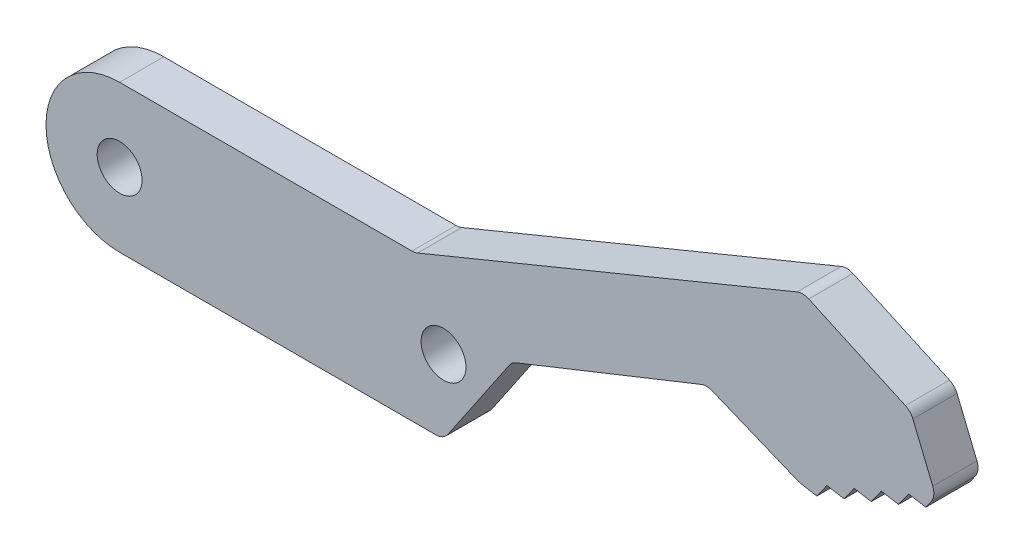
ISO-10303-21;
HEADER;
FILE_DESCRIPTION(('STEP AP214'),'2;1');
FILE_NAME('part.step','',(''),(''),'','','');
FILE_SCHEMA(('AUTOMOTIVE_DESIGN { 1 0 10303 214 1 1 1 1 }'));
ENDSEC;
DATA;
#1=APPLICATION_CONTEXT('core data for automotive mechanical design processes');
#2=APPLICATION_PROTOCOL_DEFINITION('international standard','automotive_design',2000,#1);
#3=PRODUCT_CONTEXT('',#1,'mechanical');
#4=PRODUCT('Part','Part','',(#3));
#5=PRODUCT_RELATED_PRODUCT_CATEGORY('part','',(#4));
#6=PRODUCT_DEFINITION_FORMATION('','',#4);
#7=PRODUCT_DEFINITION_CONTEXT('part definition',#1,'design');
#8=PRODUCT_DEFINITION('design','',#6,#7);
#9=PRODUCT_DEFINITION_SHAPE('','',#8);
#10=(LENGTH_UNIT() NAMED_UNIT(*) SI_UNIT(.MILLI.,.METRE.));
#11=(NAMED_UNIT(*) PLANE_ANGLE_UNIT() SI_UNIT($,.RADIAN.));
#12=(NAMED_UNIT(*) SI_UNIT($,.STERADIAN.) SOLID_ANGLE_UNIT());
#13=UNCERTAINTY_MEASURE_WITH_UNIT(LENGTH_MEASURE(1.E-05),#10,'distance_accuracy_value','');
#14=(GEOMETRIC_REPRESENTATION_CONTEXT(3) GLOBAL_UNCERTAINTY_ASSIGNED_CONTEXT((#13)) GLOBAL_UNIT_ASSIGNED_CONTEXT((#10,
#11,#12)) REPRESENTATION_CONTEXT('',''));
#15=CARTESIAN_POINT('',(0.,0.,0.));
#16=DIRECTION('',(0.,0.,1.));
#17=DIRECTION('',(1.,0.,0.));
#18=AXIS2_PLACEMENT_3D('',#15,#16,#17);
#19=CARTESIAN_POINT('',(17.3962094769043,-11.7918515015879,3.));
#20=DIRECTION('',(0.82775687017251,-0.561086948593719,0.));
#21=DIRECTION('',(0.561086948593719,0.82775687017251,0.));
#22=AXIS2_PLACEMENT_3D('',#19,#20,#21);
#23=PLANE('',#22);
#24=DIRECTION('',(-0.561086948593719,-0.82775687017251,0.));
#25=VECTOR('',#24,1.);
#26=CARTESIAN_POINT('',(17.3962094769043,-11.7918515015879,0.));
#27=LINE('',#26,#25);
#28=CARTESIAN_POINT('',(26.4721926347983,1.59770858592846,0.));
#29=VERTEX_POINT('',#28);
#30=CARTESIAN_POINT('',(22.2975129456313,-4.56108694859372,0.));
#31=VERTEX_POINT('',#30);
#32=EDGE_CURVE('E351',#29,#31,#27,.T.);
#33=ORIENTED_EDGE('',*,*,#32,.F.);
#34=DIRECTION('',(0.,0.,-1.));
#35=VECTOR('',#34,1.);
#36=CARTESIAN_POINT('',(26.4721926347983,1.59770858592845,3.));
#37=LINE('',#36,#35);
#38=CARTESIAN_POINT('',(26.4721926347983,1.59770858592846,3.));
#39=VERTEX_POINT('',#38);
#40=EDGE_CURVE('E254',#29,#39,#37,.F.);
#41=ORIENTED_EDGE('',*,*,#40,.T.);
#42=DIRECTION('',(-0.561086948593719,-0.82775687017251,0.));
#43=VECTOR('',#42,1.);
#44=CARTESIAN_POINT('',(17.3962094769043,-11.7918515015879,3.));
#45=LINE('',#44,#43);
#46=CARTESIAN_POINT('',(22.2975129456313,-4.56108694859372,3.));
#47=VERTEX_POINT('',#46);
#48=EDGE_CURVE('E768',#39,#47,#45,.T.);
#49=ORIENTED_EDGE('',*,*,#48,.T.);
#50=DIRECTION('',(0.,0.,-1.));
#51=VECTOR('',#50,1.);
#52=CARTESIAN_POINT('',(22.2975129456313,-4.56108694859372,0.));
#53=LINE('',#52,#51);
#54=EDGE_CURVE('E251',#47,#31,#53,.T.);
#55=ORIENTED_EDGE('',*,*,#54,.T.);
#56=EDGE_LOOP('',(#33,#41,#49,#55));
#57=FACE_BOUND('',#56,.T.);
#58=ADVANCED_FACE('F34',(#57),#23,.T.);
#59=CARTESIAN_POINT('',(3.01771045687276,-7.56855690668185,3.));
#60=DIRECTION('',(0.370362872235569,-0.928887152925166,0.));
#61=DIRECTION('',(0.928887152925166,0.370362872235569,0.));
#62=AXIS2_PLACEMENT_3D('',#59,#60,#61);
#63=PLANE('',#62);
#64=DIRECTION('',(-0.928887152925166,-0.370362872235569,0.));
#65=VECTOR('',#64,1.);
#66=CARTESIAN_POINT('',(3.01771045687276,-7.56855690668185,3.));
#67=LINE('',#66,#65);
#68=CARTESIAN_POINT('',(39.4964940516571,6.97614534835353,3.));
#69=VERTEX_POINT('',#68);
#70=CARTESIAN_POINT('',(26.9295866327353,1.9655087902599,3.));
#71=VERTEX_POINT('',#70);
#72=EDGE_CURVE('E775',#69,#71,#67,.T.);
#73=ORIENTED_EDGE('',*,*,#72,.T.);
#74=DIRECTION('',(0.,0.,-1.));
#75=VECTOR('',#74,1.);
#76=CARTESIAN_POINT('',(26.9295866327353,1.9655087902599,0.));
#77=LINE('',#76,#75);
#78=CARTESIAN_POINT('',(26.9295866327353,1.9655087902599,0.));
#79=VERTEX_POINT('',#78);
#80=EDGE_CURVE('E243',#71,#79,#77,.T.);
#81=ORIENTED_EDGE('',*,*,#80,.T.);
#82=DIRECTION('',(-0.928887152925166,-0.370362872235569,0.));
#83=VECTOR('',#82,1.);
#84=CARTESIAN_POINT('',(3.01771045687276,-7.56855690668185,0.));
#85=LINE('',#84,#83);
#86=CARTESIAN_POINT('',(39.4964940516571,6.97614534835353,0.));
#87=VERTEX_POINT('',#86);
#88=EDGE_CURVE('E353',#87,#79,#85,.T.);
#89=ORIENTED_EDGE('',*,*,#88,.F.);
#90=DIRECTION('',(0.,0.,-1.));
#91=VECTOR('',#90,1.);
#92=CARTESIAN_POINT('',(39.4964940516571,6.97614534835353,3.));
#93=LINE('',#92,#91);
#94=EDGE_CURVE('E241',#87,#69,#93,.F.);
#95=ORIENTED_EDGE('',*,*,#94,.T.);
#96=EDGE_LOOP('',(#73,#81,#89,#95));
#97=FACE_BOUND('',#96,.T.);
#98=ADVANCED_FACE('F496',(#97),#63,.T.);
#99=CARTESIAN_POINT('',(8.22079154562797,20.0822867610106,3.));
#100=DIRECTION('',(-0.378842481424512,-0.925461168428,0.));
#101=DIRECTION('',(0.925461168428,-0.378842481424512,0.));
#102=AXIS2_PLACEMENT_3D('',#99,#100,#101);
#103=PLANE('',#102);
#104=DIRECTION('',(-0.925461168428,0.378842481424512,0.));
#105=VECTOR('',#104,1.);
#106=CARTESIAN_POINT('',(8.22079154562797,20.0822867610106,3.));
#107=LINE('',#106,#105);
#108=CARTESIAN_POINT('',(46.0879419933528,4.58116609869354,3.));
#109=VERTEX_POINT('',#108);
#110=CARTESIAN_POINT('',(40.2456994053172,6.97271936385637,3.));
#111=VERTEX_POINT('',#110);
#112=EDGE_CURVE('E226',#109,#111,#107,.T.);
#113=ORIENTED_EDGE('',*,*,#112,.T.);
#114=DIRECTION('',(0.,0.,-1.));
#115=VECTOR('',#114,1.);
#116=CARTESIAN_POINT('',(40.2456994053171,6.97271936385637,0.));
#117=LINE('',#116,#115);
#118=CARTESIAN_POINT('',(40.2456994053172,6.97271936385637,0.));
#119=VERTEX_POINT('',#118);
#120=EDGE_CURVE('E278',#111,#119,#117,.T.);
#121=ORIENTED_EDGE('',*,*,#120,.T.);
#122=DIRECTION('',(-0.925461168428,0.378842481424512,0.));
#123=VECTOR('',#122,1.);
#124=CARTESIAN_POINT('',(8.22079154562797,20.0822867610106,0.));
#125=LINE('',#124,#123);
#126=CARTESIAN_POINT('',(46.0879419933528,4.58116609869354,0.));
#127=VERTEX_POINT('',#126);
#128=EDGE_CURVE('E356',#127,#119,#125,.T.);
#129=ORIENTED_EDGE('',*,*,#128,.F.);
#130=DIRECTION('',(0.,0.,-1.));
#131=VECTOR('',#130,1.);
#132=CARTESIAN_POINT('',(46.0879419933528,4.58116609869354,3.));
#133=LINE('',#132,#131);
#134=EDGE_CURVE('E276',#127,#109,#133,.F.);
#135=ORIENTED_EDGE('',*,*,#134,.T.);
#136=EDGE_LOOP('',(#113,#121,#129,#135));
#137=FACE_BOUND('',#136,.T.);
#138=ADVANCED_FACE('F502',(#137),#103,.T.);
#139=CARTESIAN_POINT('',(2.12068725055261,12.2001062019428,3.));
#140=DIRECTION('',(0.171257275030367,0.985226342395073,0.));
#141=DIRECTION('',(-0.985226342395073,0.171257275030367,0.));
#142=AXIS2_PLACEMENT_3D('',#139,#140,#141);
#143=PLANE('',#142);
#144=DIRECTION('',(0.985226342395073,-0.171257275030367,0.));
#145=VECTOR('',#144,1.);
#146=CARTESIAN_POINT('',(2.12068725055261,12.2001062019428,3.));
#147=LINE('',#146,#145);
#148=CARTESIAN_POINT('',(46.2955271997469,4.52140092472648,3.));
#149=VERTEX_POINT('',#148);
#150=CARTESIAN_POINT('',(47.3529322035688,4.33759717145107,3.));
#151=VERTEX_POINT('',#150);
#152=EDGE_CURVE('E212',#149,#151,#147,.T.);
#153=ORIENTED_EDGE('',*,*,#152,.F.);
#154=DIRECTION('',(0.,0.,-1.));
#155=VECTOR('',#154,1.);
#156=CARTESIAN_POINT('',(46.2955271997469,4.52140092472648,0.));
#157=LINE('',#156,#155);
#158=CARTESIAN_POINT('',(46.2955271997469,4.52140092472648,0.));
#159=VERTEX_POINT('',#158);
#160=EDGE_CURVE('E281',#149,#159,#157,.T.);
#161=ORIENTED_EDGE('',*,*,#160,.T.);
#162=DIRECTION('',(0.985226342395073,-0.171257275030367,0.));
#163=VECTOR('',#162,1.);
#164=CARTESIAN_POINT('',(2.12068725055261,12.2001062019428,0.));
#165=LINE('',#164,#163);
#166=CARTESIAN_POINT('',(47.3529322035688,4.33759717145107,0.));
#167=VERTEX_POINT('',#166);
#168=EDGE_CURVE('E239',#159,#167,#165,.T.);
#169=ORIENTED_EDGE('',*,*,#168,.T.);
#170=DIRECTION('',(0.,0.,-1.));
#171=VECTOR('',#170,1.);
#172=CARTESIAN_POINT('',(47.3529322035688,4.33759717145107,3.));
#173=LINE('',#172,#171);
#174=EDGE_CURVE('E232',#151,#167,#173,.T.);
#175=ORIENTED_EDGE('',*,*,#174,.F.);
#176=EDGE_LOOP('',(#153,#161,#169,#175));
#177=FACE_BOUND('',#176,.T.);
#178=ADVANCED_FACE('F237',(#177),#143,.F.);
#179=CARTESIAN_POINT('',(29.3832302084347,-20.911746854221,3.));
#180=DIRECTION('',(-0.814732571298571,0.579836905746106,0.));
#181=DIRECTION('',(-0.579836905746107,-0.814732571298571,0.));
#182=AXIS2_PLACEMENT_3D('',#179,#180,#181);
#183=PLANE('',#182);
#184=DIRECTION('',(0.579836905746107,0.814732571298571,0.));
#185=VECTOR('',#184,1.);
#186=CARTESIAN_POINT('',(29.3832302084347,-20.911746854221,0.));
#187=LINE('',#186,#185);
#188=CARTESIAN_POINT('',(48.0382444817135,5.30053386792921,0.));
#189=VERTEX_POINT('',#188);
#190=EDGE_CURVE('E360',#167,#189,#187,.T.);
#191=ORIENTED_EDGE('',*,*,#190,.T.);
#192=DIRECTION('',(0.,0.,-1.));
#193=VECTOR('',#192,1.);
#194=CARTESIAN_POINT('',(48.0382444817135,5.30053386792921,3.));
#195=LINE('',#194,#193);
#196=CARTESIAN_POINT('',(48.0382444817135,5.30053386792921,3.));
#197=VERTEX_POINT('',#196);
#198=EDGE_CURVE('E234',#197,#189,#195,.T.);
#199=ORIENTED_EDGE('',*,*,#198,.F.);
#200=DIRECTION('',(0.579836905746107,0.814732571298571,0.));
#201=VECTOR('',#200,1.);
#202=CARTESIAN_POINT('',(29.3832302084347,-20.911746854221,3.));
#203=LINE('',#202,#201);
#204=EDGE_CURVE('E217',#151,#197,#203,.T.);
#205=ORIENTED_EDGE('',*,*,#204,.F.);
#206=ORIENTED_EDGE('',*,*,#174,.T.);
#207=EDGE_LOOP('',(#191,#199,#205,#206));
#208=FACE_BOUND('',#207,.T.);
#209=ADVANCED_FACE('F231',(#208),#183,.F.);
#210=CARTESIAN_POINT('',(2.30326040358772,13.2504316830205,3.));
#211=DIRECTION('',(0.171257275030366,0.985226342395073,0.));
#212=DIRECTION('',(-0.985226342395073,0.171257275030366,0.));
#213=AXIS2_PLACEMENT_3D('',#210,#211,#212);
#214=PLANE('',#213);
#215=DIRECTION('',(0.985226342395073,-0.171257275030366,0.));
#216=VECTOR('',#215,1.);
#217=CARTESIAN_POINT('',(2.30326040358772,13.2504316830205,0.));
#218=LINE('',#217,#216);
#219=CARTESIAN_POINT('',(49.2026886599019,5.09812399691749,0.));
#220=VERTEX_POINT('',#219);
#221=EDGE_CURVE('E362',#189,#220,#218,.T.);
#222=ORIENTED_EDGE('',*,*,#221,.T.);
#223=DIRECTION('',(0.,0.,-1.));
#224=VECTOR('',#223,1.);
#225=CARTESIAN_POINT('',(49.2026886599019,5.09812399691749,3.));
#226=LINE('',#225,#224);
#227=CARTESIAN_POINT('',(49.2026886599019,5.09812399691749,3.));
#228=VERTEX_POINT('',#227);
#229=EDGE_CURVE('E245',#228,#220,#226,.T.);
#230=ORIENTED_EDGE('',*,*,#229,.F.);
#231=DIRECTION('',(0.985226342395073,-0.171257275030366,0.));
#232=VECTOR('',#231,1.);
#233=CARTESIAN_POINT('',(2.30326040358772,13.2504316830205,3.));
#234=LINE('',#233,#232);
#235=EDGE_CURVE('E235',#197,#228,#234,.T.);
#236=ORIENTED_EDGE('',*,*,#235,.F.);
#237=ORIENTED_EDGE('',*,*,#198,.T.);
#238=EDGE_LOOP('',(#222,#230,#236,#237));
#239=FACE_BOUND('',#238,.T.);
#240=ADVANCED_FACE('F427',(#239),#214,.F.);
#241=CARTESIAN_POINT('',(30.2517964891723,-21.5298966648462,3.));
#242=DIRECTION('',(-0.81473257129857,0.579836905746108,0.));
#243=DIRECTION('',(-0.579836905746108,-0.81473257129857,0.));
#244=AXIS2_PLACEMENT_3D('',#241,#242,#243);
#245=PLANE('',#244);
#246=DIRECTION('',(0.579836905746108,0.81473257129857,0.));
#247=VECTOR('',#246,1.);
#248=CARTESIAN_POINT('',(30.2517964891723,-21.5298966648462,0.));
#249=LINE('',#248,#247);
#250=CARTESIAN_POINT('',(49.8880009380466,6.06106069339563,0.));
#251=VERTEX_POINT('',#250);
#252=EDGE_CURVE('E365',#220,#251,#249,.T.);
#253=ORIENTED_EDGE('',*,*,#252,.T.);
#254=DIRECTION('',(0.,0.,-1.));
#255=VECTOR('',#254,1.);
#256=CARTESIAN_POINT('',(49.8880009380466,6.06106069339563,3.));
#257=LINE('',#256,#255);
#258=CARTESIAN_POINT('',(49.8880009380466,6.06106069339563,3.));
#259=VERTEX_POINT('',#258);
#260=EDGE_CURVE('E417',#259,#251,#257,.T.);
#261=ORIENTED_EDGE('',*,*,#260,.F.);
#262=DIRECTION('',(0.579836905746108,0.81473257129857,0.));
#263=VECTOR('',#262,1.);
#264=CARTESIAN_POINT('',(30.2517964891723,-21.5298966648462,3.));
#265=LINE('',#264,#263);
#266=EDGE_CURVE('E425',#228,#259,#265,.T.);
#267=ORIENTED_EDGE('',*,*,#266,.F.);
#268=ORIENTED_EDGE('',*,*,#229,.T.);
#269=EDGE_LOOP('',(#253,#261,#267,#268));
#270=FACE_BOUND('',#269,.T.);
#271=ADVANCED_FACE('F422',(#270),#245,.F.);
#272=CARTESIAN_POINT('',(2.48583355662284,14.3007571640983,3.));
#273=DIRECTION('',(0.171257275030366,0.985226342395073,0.));
#274=DIRECTION('',(-0.985226342395073,0.171257275030366,0.));
#275=AXIS2_PLACEMENT_3D('',#272,#273,#274);
#276=PLANE('',#275);
#277=DIRECTION('',(0.985226342395073,-0.171257275030366,0.));
#278=VECTOR('',#277,1.);
#279=CARTESIAN_POINT('',(2.48583355662284,14.3007571640983,0.));
#280=LINE('',#279,#278);
#281=CARTESIAN_POINT('',(51.052445116235,5.85865082238391,0.));
#282=VERTEX_POINT('',#281);
#283=EDGE_CURVE('E368',#251,#282,#280,.T.);
#284=ORIENTED_EDGE('',*,*,#283,.T.);
#285=DIRECTION('',(0.,0.,-1.));
#286=VECTOR('',#285,1.);
#287=CARTESIAN_POINT('',(51.052445116235,5.85865082238391,3.));
#288=LINE('',#287,#286);
#289=CARTESIAN_POINT('',(51.052445116235,5.85865082238391,3.));
#290=VERTEX_POINT('',#289);
#291=EDGE_CURVE('E414',#290,#282,#288,.T.);
#292=ORIENTED_EDGE('',*,*,#291,.F.);
#293=DIRECTION('',(0.985226342395073,-0.171257275030366,0.));
#294=VECTOR('',#293,1.);
#295=CARTESIAN_POINT('',(2.48583355662284,14.3007571640983,3.));
#296=LINE('',#295,#294);
#297=EDGE_CURVE('E432',#259,#290,#296,.T.);
#298=ORIENTED_EDGE('',*,*,#297,.F.);
#299=ORIENTED_EDGE('',*,*,#260,.T.);
#300=EDGE_LOOP('',(#284,#292,#298,#299));
#301=FACE_BOUND('',#300,.T.);
#302=ADVANCED_FACE('F430',(#301),#276,.F.);
#303=CARTESIAN_POINT('',(31.1203627699101,-22.1480464754713,3.));
#304=DIRECTION('',(-0.814732571298571,0.579836905746105,0.));
#305=DIRECTION('',(-0.579836905746105,-0.814732571298572,0.));
#306=AXIS2_PLACEMENT_3D('',#303,#304,#305);
#307=PLANE('',#306);
#308=DIRECTION('',(0.579836905746105,0.814732571298572,0.));
#309=VECTOR('',#308,1.);
#310=CARTESIAN_POINT('',(31.1203627699101,-22.1480464754713,0.));
#311=LINE('',#310,#309);
#312=CARTESIAN_POINT('',(51.7377573943797,6.82158751886204,0.));
#313=VERTEX_POINT('',#312);
#314=EDGE_CURVE('E371',#282,#313,#311,.T.);
#315=ORIENTED_EDGE('',*,*,#314,.T.);
#316=DIRECTION('',(0.,0.,-1.));
#317=VECTOR('',#316,1.);
#318=CARTESIAN_POINT('',(51.7377573943797,6.82158751886204,3.));
#319=LINE('',#318,#317);
#320=CARTESIAN_POINT('',(51.7377573943797,6.82158751886204,3.));
#321=VERTEX_POINT('',#320);
#322=EDGE_CURVE('E411',#321,#313,#319,.T.);
#323=ORIENTED_EDGE('',*,*,#322,.F.);
#324=DIRECTION('',(0.579836905746105,0.814732571298572,0.));
#325=VECTOR('',#324,1.);
#326=CARTESIAN_POINT('',(31.1203627699101,-22.1480464754713,3.));
#327=LINE('',#326,#325);
#328=EDGE_CURVE('E434',#290,#321,#327,.T.);
#329=ORIENTED_EDGE('',*,*,#328,.F.);
#330=ORIENTED_EDGE('',*,*,#291,.T.);
#331=EDGE_LOOP('',(#315,#323,#329,#330));
#332=FACE_BOUND('',#331,.T.);
#333=ADVANCED_FACE('F486',(#332),#307,.F.);
#334=CARTESIAN_POINT('',(2.66840670965796,15.351082645176,3.));
#335=DIRECTION('',(0.171257275030366,0.985226342395073,0.));
#336=DIRECTION('',(-0.985226342395073,0.171257275030366,0.));
#337=AXIS2_PLACEMENT_3D('',#334,#335,#336);
#338=PLANE('',#337);
#339=DIRECTION('',(0.985226342395073,-0.171257275030366,0.));
#340=VECTOR('',#339,1.);
#341=CARTESIAN_POINT('',(2.66840670965796,15.351082645176,0.));
#342=LINE('',#341,#340);
#343=CARTESIAN_POINT('',(52.9022015725681,6.61917764785032,0.));
#344=VERTEX_POINT('',#343);
#345=EDGE_CURVE('E374',#313,#344,#342,.T.);
#346=ORIENTED_EDGE('',*,*,#345,.T.);
#347=DIRECTION('',(0.,0.,-1.));
#348=VECTOR('',#347,1.);
#349=CARTESIAN_POINT('',(52.9022015725681,6.61917764785032,3.));
#350=LINE('',#349,#348);
#351=CARTESIAN_POINT('',(52.9022015725681,6.61917764785032,3.));
#352=VERTEX_POINT('',#351);
#353=EDGE_CURVE('E408',#352,#344,#350,.T.);
#354=ORIENTED_EDGE('',*,*,#353,.F.);
#355=DIRECTION('',(0.985226342395073,-0.171257275030366,0.));
#356=VECTOR('',#355,1.);
#357=CARTESIAN_POINT('',(2.66840670965796,15.351082645176,3.));
#358=LINE('',#357,#356);
#359=EDGE_CURVE('E440',#321,#352,#358,.T.);
#360=ORIENTED_EDGE('',*,*,#359,.F.);
#361=ORIENTED_EDGE('',*,*,#322,.T.);
#362=EDGE_LOOP('',(#346,#354,#360,#361));
#363=FACE_BOUND('',#362,.T.);
#364=ADVANCED_FACE('F483',(#363),#338,.F.);
#365=CARTESIAN_POINT('',(31.988929050648,-22.7661962860964,3.));
#366=DIRECTION('',(-0.814732571298574,0.579836905746103,0.));
#367=DIRECTION('',(-0.579836905746103,-0.814732571298574,0.));
#368=AXIS2_PLACEMENT_3D('',#365,#366,#367);
#369=PLANE('',#368);
#370=DIRECTION('',(0.579836905746103,0.814732571298574,0.));
#371=VECTOR('',#370,1.);
#372=CARTESIAN_POINT('',(31.988929050648,-22.7661962860964,0.));
#373=LINE('',#372,#371);
#374=CARTESIAN_POINT('',(53.5875138507128,7.58211434432846,0.));
#375=VERTEX_POINT('',#374);
#376=EDGE_CURVE('E377',#344,#375,#373,.T.);
#377=ORIENTED_EDGE('',*,*,#376,.T.);
#378=DIRECTION('',(0.,0.,-1.));
#379=VECTOR('',#378,1.);
#380=CARTESIAN_POINT('',(53.5875138507128,7.58211434432846,3.));
#381=LINE('',#380,#379);
#382=CARTESIAN_POINT('',(53.5875138507128,7.58211434432846,3.));
#383=VERTEX_POINT('',#382);
#384=EDGE_CURVE('E405',#383,#375,#381,.T.);
#385=ORIENTED_EDGE('',*,*,#384,.F.);
#386=DIRECTION('',(0.579836905746103,0.814732571298574,0.));
#387=VECTOR('',#386,1.);
#388=CARTESIAN_POINT('',(31.988929050648,-22.7661962860964,3.));
#389=LINE('',#388,#387);
#390=EDGE_CURVE('E443',#352,#383,#389,.T.);
#391=ORIENTED_EDGE('',*,*,#390,.F.);
#392=ORIENTED_EDGE('',*,*,#353,.T.);
#393=EDGE_LOOP('',(#377,#385,#391,#392));
#394=FACE_BOUND('',#393,.T.);
#395=ADVANCED_FACE('F481',(#394),#369,.F.);
#396=CARTESIAN_POINT('',(2.85097986269345,16.4014081262544,3.));
#397=DIRECTION('',(0.171257275030381,0.98522634239507,0.));
#398=DIRECTION('',(-0.985226342395071,0.171257275030381,0.));
#399=AXIS2_PLACEMENT_3D('',#396,#397,#398);
#400=PLANE('',#399);
#401=DIRECTION('',(0.98522634239507,-0.171257275030381,0.));
#402=VECTOR('',#401,1.);
#403=CARTESIAN_POINT('',(2.85097986269345,16.4014081262544,0.));
#404=LINE('',#403,#402);
#405=CARTESIAN_POINT('',(54.7519580289012,7.37970447331672,0.));
#406=VERTEX_POINT('',#405);
#407=EDGE_CURVE('E380',#375,#406,#404,.T.);
#408=ORIENTED_EDGE('',*,*,#407,.T.);
#409=DIRECTION('',(0.,0.,-1.));
#410=VECTOR('',#409,1.);
#411=CARTESIAN_POINT('',(54.7519580289012,7.37970447331672,3.));
#412=LINE('',#411,#410);
#413=CARTESIAN_POINT('',(54.7519580289012,7.37970447331672,3.));
#414=VERTEX_POINT('',#413);
#415=EDGE_CURVE('E402',#414,#406,#412,.T.);
#416=ORIENTED_EDGE('',*,*,#415,.F.);
#417=DIRECTION('',(0.98522634239507,-0.171257275030381,0.));
#418=VECTOR('',#417,1.);
#419=CARTESIAN_POINT('',(2.85097986269345,16.4014081262544,3.));
#420=LINE('',#419,#418);
#421=EDGE_CURVE('E446',#383,#414,#420,.T.);
#422=ORIENTED_EDGE('',*,*,#421,.F.);
#423=ORIENTED_EDGE('',*,*,#384,.T.);
#424=EDGE_LOOP('',(#408,#416,#422,#423));
#425=FACE_BOUND('',#424,.T.);
#426=ADVANCED_FACE('F477',(#425),#400,.F.);
#427=CARTESIAN_POINT('',(32.8574953313856,-23.3843460967215,3.));
#428=DIRECTION('',(-0.814732571298573,0.579836905746103,0.));
#429=DIRECTION('',(-0.579836905746103,-0.814732571298573,0.));
#430=AXIS2_PLACEMENT_3D('',#427,#428,#429);
#431=PLANE('',#430);
#432=DIRECTION('',(0.579836905746103,0.814732571298573,0.));
#433=VECTOR('',#432,1.);
#434=CARTESIAN_POINT('',(32.8574953313856,-23.3843460967215,0.));
#435=LINE('',#434,#433);
#436=CARTESIAN_POINT('',(55.1172552795213,7.89298599323486,0.));
#437=VERTEX_POINT('',#436);
#438=EDGE_CURVE('E383',#406,#437,#435,.T.);
#439=ORIENTED_EDGE('',*,*,#438,.T.);
#440=DIRECTION('',(0.,0.,-1.));
#441=VECTOR('',#440,1.);
#442=CARTESIAN_POINT('',(55.1172552795213,7.89298599323485,3.));
#443=LINE('',#442,#441);
#444=CARTESIAN_POINT('',(55.1172552795213,7.89298599323486,3.));
#445=VERTEX_POINT('',#444);
#446=EDGE_CURVE('E288',#437,#445,#443,.F.);
#447=ORIENTED_EDGE('',*,*,#446,.T.);
#448=DIRECTION('',(0.579836905746103,0.814732571298573,0.));
#449=VECTOR('',#448,1.);
#450=CARTESIAN_POINT('',(32.8574953313856,-23.3843460967215,3.));
#451=LINE('',#450,#449);
#452=EDGE_CURVE('E449',#414,#445,#451,.T.);
#453=ORIENTED_EDGE('',*,*,#452,.F.);
#454=ORIENTED_EDGE('',*,*,#415,.T.);
#455=EDGE_LOOP('',(#439,#447,#453,#454));
#456=FACE_BOUND('',#455,.T.);
#457=ADVANCED_FACE('F474',(#456),#431,.F.);
#458=CARTESIAN_POINT('',(50.3551112402656,20.703489243922,3.));
#459=DIRECTION('',(0.924878228166548,0.380263412733208,0.));
#460=DIRECTION('',(-0.380263412733208,0.924878228166548,0.));
#461=AXIS2_PLACEMENT_3D('',#458,#459,#460);
#462=PLANE('',#461);
#463=DIRECTION('',(0.380263412733209,-0.924878228166548,0.));
#464=VECTOR('',#463,1.);
#465=CARTESIAN_POINT('',(50.3551112402656,20.703489243922,3.));
#466=LINE('',#465,#464);
#467=CARTESIAN_POINT('',(53.8764912996726,12.138774256918,3.));
#468=VERTEX_POINT('',#467);
#469=CARTESIAN_POINT('',(55.2274009363892,8.85308631171416,3.));
#470=VERTEX_POINT('',#469);
#471=EDGE_CURVE('E452',#468,#470,#466,.T.);
#472=ORIENTED_EDGE('',*,*,#471,.T.);
#473=DIRECTION('',(0.,0.,-1.));
#474=VECTOR('',#473,1.);
#475=CARTESIAN_POINT('',(55.2274009363892,8.85308631171416,0.));
#476=LINE('',#475,#474);
#477=CARTESIAN_POINT('',(55.2274009363892,8.85308631171416,0.));
#478=VERTEX_POINT('',#477);
#479=EDGE_CURVE('E285',#470,#478,#476,.T.);
#480=ORIENTED_EDGE('',*,*,#479,.T.);
#481=DIRECTION('',(0.380263412733209,-0.924878228166548,0.));
#482=VECTOR('',#481,1.);
#483=CARTESIAN_POINT('',(50.3551112402656,20.703489243922,0.));
#484=LINE('',#483,#482);
#485=CARTESIAN_POINT('',(53.8764912996726,12.138774256918,0.));
#486=VERTEX_POINT('',#485);
#487=EDGE_CURVE('E386',#486,#478,#484,.T.);
#488=ORIENTED_EDGE('',*,*,#487,.F.);
#489=DIRECTION('',(0.,0.,-1.));
#490=VECTOR('',#489,1.);
#491=CARTESIAN_POINT('',(53.8764912996726,12.138774256918,3.));
#492=LINE('',#491,#490);
#493=EDGE_CURVE('E283',#486,#468,#492,.F.);
#494=ORIENTED_EDGE('',*,*,#493,.T.);
#495=EDGE_LOOP('',(#472,#480,#488,#494));
#496=FACE_BOUND('',#495,.T.);
#497=ADVANCED_FACE('F466',(#496),#462,.T.);
#498=CARTESIAN_POINT('',(13.9488099268583,30.6231164748254,3.));
#499=DIRECTION('',(0.414522259932087,0.910039172794663,0.));
#500=DIRECTION('',(-0.910039172794663,0.414522259932087,0.));
#501=AXIS2_PLACEMENT_3D('',#498,#499,#500);
#502=PLANE('',#501);
#503=DIRECTION('',(0.910039172794663,-0.414522259932087,0.));
#504=VECTOR('',#503,1.);
#505=CARTESIAN_POINT('',(13.9488099268583,30.6231164748254,3.));
#506=LINE('',#505,#504);
#507=CARTESIAN_POINT('',(46.8032086062433,15.6579589338968,3.));
#508=VERTEX_POINT('',#507);
#509=CARTESIAN_POINT('',(53.3661353314382,12.6685500169795,3.));
#510=VERTEX_POINT('',#509);
#511=EDGE_CURVE('E339',#508,#510,#506,.T.);
#512=ORIENTED_EDGE('',*,*,#511,.T.);
#513=DIRECTION('',(0.,0.,-1.));
#514=VECTOR('',#513,1.);
#515=CARTESIAN_POINT('',(53.3661353314382,12.6685500169795,3.));
#516=LINE('',#515,#514);
#517=CARTESIAN_POINT('',(53.3661353314382,12.6685500169795,0.));
#518=VERTEX_POINT('',#517);
#519=EDGE_CURVE('E292',#510,#518,#516,.T.);
#520=ORIENTED_EDGE('',*,*,#519,.T.);
#521=DIRECTION('',(0.910039172794663,-0.414522259932087,0.));
#522=VECTOR('',#521,1.);
#523=CARTESIAN_POINT('',(13.9488099268583,30.6231164748254,0.));
#524=LINE('',#523,#522);
#525=CARTESIAN_POINT('',(46.8032086062433,15.6579589338968,0.));
#526=VERTEX_POINT('',#525);
#527=EDGE_CURVE('E326',#526,#518,#524,.T.);
#528=ORIENTED_EDGE('',*,*,#527,.F.);
#529=DIRECTION('',(0.,0.,-1.));
#530=VECTOR('',#529,1.);
#531=CARTESIAN_POINT('',(46.8032086062433,15.6579589338968,3.));
#532=LINE('',#531,#530);
#533=EDGE_CURVE('E290',#526,#508,#532,.F.);
#534=ORIENTED_EDGE('',*,*,#533,.T.);
#535=EDGE_LOOP('',(#512,#520,#528,#534));
#536=FACE_BOUND('',#535,.T.);
#537=ADVANCED_FACE('F457',(#536),#502,.T.);
#538=CARTESIAN_POINT('',(1.14074851739701,-2.77453321099285,3.));
#539=DIRECTION('',(-0.380263412733207,0.924878228166549,0.));
#540=DIRECTION('',(-0.924878228166549,-0.380263412733207,0.));
#541=AXIS2_PLACEMENT_3D('',#538,#539,#540);
#542=PLANE('',#541);
#543=DIRECTION('',(0.924878228166549,0.380263412733207,0.));
#544=VECTOR('',#543,1.);
#545=CARTESIAN_POINT('',(1.14074851739701,-2.77453321099285,3.));
#546=LINE('',#545,#544);
#547=CARTESIAN_POINT('',(20.2327114807882,5.07512177183346,3.));
#548=VERTEX_POINT('',#547);
#549=CARTESIAN_POINT('',(46.0084229335781,15.6727979892687,3.));
#550=VERTEX_POINT('',#549);
#551=EDGE_CURVE('E335',#548,#550,#546,.T.);
#552=ORIENTED_EDGE('',*,*,#551,.T.);
#553=DIRECTION('',(0.,0.,-1.));
#554=VECTOR('',#553,1.);
#555=CARTESIAN_POINT('',(46.0084229335781,15.6727979892687,3.));
#556=LINE('',#555,#554);
#557=CARTESIAN_POINT('',(46.0084229335781,15.6727979892687,0.));
#558=VERTEX_POINT('',#557);
#559=EDGE_CURVE('E297',#550,#558,#556,.T.);
#560=ORIENTED_EDGE('',*,*,#559,.T.);
#561=DIRECTION('',(0.924878228166549,0.380263412733207,0.));
#562=VECTOR('',#561,1.);
#563=CARTESIAN_POINT('',(1.14074851739701,-2.77453321099285,0.));
#564=LINE('',#563,#562);
#565=CARTESIAN_POINT('',(20.2327114807882,5.07512177183346,0.));
#566=VERTEX_POINT('',#565);
#567=EDGE_CURVE('E316',#566,#558,#564,.T.);
#568=ORIENTED_EDGE('',*,*,#567,.F.);
#569=DIRECTION('',(0.,0.,-1.));
#570=VECTOR('',#569,1.);
#571=CARTESIAN_POINT('',(20.2327114807882,5.07512177183345,3.));
#572=LINE('',#571,#570);
#573=EDGE_CURVE('E295',#566,#548,#572,.F.);
#574=ORIENTED_EDGE('',*,*,#573,.T.);
#575=EDGE_LOOP('',(#552,#560,#568,#574));
#576=FACE_BOUND('',#575,.T.);
#577=ADVANCED_FACE('F324',(#576),#542,.T.);
#578=CARTESIAN_POINT('',(0.,5.,3.));
#579=DIRECTION('',(0.,1.,0.));
#580=DIRECTION('',(0.,0.,1.));
#581=AXIS2_PLACEMENT_3D('',#578,#579,#580);
#582=PLANE('',#581);
#583=DIRECTION('',(1.,0.,0.));
#584=VECTOR('',#583,1.);
#585=CARTESIAN_POINT('',(0.,5.,3.));
#586=LINE('',#585,#584);
#587=CARTESIAN_POINT('',(0.,5.,3.));
#588=VERTEX_POINT('',#587);
#589=CARTESIAN_POINT('',(19.852448068055,5.,3.));
#590=VERTEX_POINT('',#589);
#591=EDGE_CURVE('E330',#588,#590,#586,.T.);
#592=ORIENTED_EDGE('',*,*,#591,.T.);
#593=DIRECTION('',(0.,0.,-1.));
#594=VECTOR('',#593,1.);
#595=CARTESIAN_POINT('',(19.852448068055,5.,0.));
#596=LINE('',#595,#594);
#597=CARTESIAN_POINT('',(19.852448068055,5.,0.));
#598=VERTEX_POINT('',#597);
#599=EDGE_CURVE('E300',#590,#598,#596,.T.);
#600=ORIENTED_EDGE('',*,*,#599,.T.);
#601=DIRECTION('',(1.,0.,0.));
#602=VECTOR('',#601,1.);
#603=CARTESIAN_POINT('',(0.,5.,0.));
#604=LINE('',#603,#602);
#605=CARTESIAN_POINT('',(0.,5.,0.));
#606=VERTEX_POINT('',#605);
#607=EDGE_CURVE('E319',#606,#598,#604,.T.);
#608=ORIENTED_EDGE('',*,*,#607,.F.);
#609=DIRECTION('',(0.,0.,-1.));
#610=VECTOR('',#609,1.);
#611=CARTESIAN_POINT('',(0.,5.,3.));
#612=LINE('',#611,#610);
#613=EDGE_CURVE('E331',#588,#606,#612,.T.);
#614=ORIENTED_EDGE('',*,*,#613,.F.);
#615=EDGE_LOOP('',(#592,#600,#608,#614));
#616=FACE_BOUND('',#615,.T.);
#617=ADVANCED_FACE('F329',(#616),#582,.T.);
#618=CARTESIAN_POINT('',(0.,0.,3.));
#619=DIRECTION('',(0.,0.,-1.));
#620=DIRECTION('',(-1.,0.,0.));
#621=AXIS2_PLACEMENT_3D('',#618,#619,#620);
#622=CYLINDRICAL_SURFACE('',#621,5.);
#623=CARTESIAN_POINT('',(0.,0.,0.));
#624=DIRECTION('',(0.,0.,1.));
#625=DIRECTION('',(1.,0.,0.));
#626=AXIS2_PLACEMENT_3D('',#623,#624,#625);
#627=CIRCLE('',#626,5.);
#628=CARTESIAN_POINT('',(0.,-5.,0.));
#629=VERTEX_POINT('',#628);
#630=EDGE_CURVE('E392',#606,#629,#627,.T.);
#631=ORIENTED_EDGE('',*,*,#630,.T.);
#632=DIRECTION('',(0.,0.,-1.));
#633=VECTOR('',#632,1.);
#634=CARTESIAN_POINT('',(0.,-5.,3.));
#635=LINE('',#634,#633);
#636=CARTESIAN_POINT('',(0.,-5.,3.));
#637=VERTEX_POINT('',#636);
#638=EDGE_CURVE('E344',#637,#629,#635,.T.);
#639=ORIENTED_EDGE('',*,*,#638,.F.);
#640=CARTESIAN_POINT('',(0.,0.,3.));
#641=DIRECTION('',(0.,0.,1.));
#642=DIRECTION('',(1.,0.,0.));
#643=AXIS2_PLACEMENT_3D('',#640,#641,#642);
#644=CIRCLE('',#643,5.);
#645=EDGE_CURVE('E334',#588,#637,#644,.T.);
#646=ORIENTED_EDGE('',*,*,#645,.F.);
#647=ORIENTED_EDGE('',*,*,#613,.T.);
#648=EDGE_LOOP('',(#631,#639,#646,#647));
#649=FACE_BOUND('',#648,.T.);
#650=ADVANCED_FACE('F512',(#649),#622,.T.);
#651=CARTESIAN_POINT('',(0.,0.,3.));
#652=DIRECTION('',(0.,0.,-1.));
#653=DIRECTION('',(-1.,0.,0.));
#654=AXIS2_PLACEMENT_3D('',#651,#652,#653);
#655=CYLINDRICAL_SURFACE('',#654,1.525);
#656=CARTESIAN_POINT('',(0.,0.,3.));
#657=DIRECTION('',(0.,0.,1.));
#658=DIRECTION('',(1.,0.,0.));
#659=AXIS2_PLACEMENT_3D('',#656,#657,#658);
#660=CIRCLE('',#659,1.525);
#661=CARTESIAN_POINT('',(1.525,0.,3.));
#662=VERTEX_POINT('',#661);
#663=EDGE_CURVE('E780',#662,#662,#660,.T.);
#664=ORIENTED_EDGE('',*,*,#663,.T.);
#665=EDGE_LOOP('',(#664));
#666=FACE_BOUND('',#665,.T.);
#667=CARTESIAN_POINT('',(0.,0.,0.));
#668=DIRECTION('',(0.,0.,1.));
#669=DIRECTION('',(1.,0.,0.));
#670=AXIS2_PLACEMENT_3D('',#667,#668,#669);
#671=CIRCLE('',#670,1.525);
#672=CARTESIAN_POINT('',(1.525,0.,0.));
#673=VERTEX_POINT('',#672);
#674=EDGE_CURVE('E348',#673,#673,#671,.T.);
#675=ORIENTED_EDGE('',*,*,#674,.F.);
#676=EDGE_LOOP('',(#675));
#677=FACE_BOUND('',#676,.T.);
#678=ADVANCED_FACE('F508',(#666,#677),#655,.F.);
#679=CARTESIAN_POINT('',(22.,0.,3.));
#680=DIRECTION('',(0.,0.,-1.));
#681=DIRECTION('',(-1.,0.,0.));
#682=AXIS2_PLACEMENT_3D('',#679,#680,#681);
#683=CYLINDRICAL_SURFACE('',#682,1.525);
#684=CARTESIAN_POINT('',(22.,0.,3.));
#685=DIRECTION('',(0.,0.,1.));
#686=DIRECTION('',(1.,0.,0.));
#687=AXIS2_PLACEMENT_3D('',#684,#685,#686);
#688=CIRCLE('',#687,1.525);
#689=CARTESIAN_POINT('',(23.525,0.,3.));
#690=VERTEX_POINT('',#689);
#691=EDGE_CURVE('E398',#690,#690,#688,.T.);
#692=ORIENTED_EDGE('',*,*,#691,.T.);
#693=EDGE_LOOP('',(#692));
#694=FACE_BOUND('',#693,.T.);
#695=CARTESIAN_POINT('',(22.,0.,0.));
#696=DIRECTION('',(0.,0.,1.));
#697=DIRECTION('',(1.,0.,0.));
#698=AXIS2_PLACEMENT_3D('',#695,#696,#697);
#699=CIRCLE('',#698,1.525);
#700=CARTESIAN_POINT('',(23.525,0.,0.));
#701=VERTEX_POINT('',#700);
#702=EDGE_CURVE('E345',#701,#701,#699,.T.);
#703=ORIENTED_EDGE('',*,*,#702,.F.);
#704=EDGE_LOOP('',(#703));
#705=FACE_BOUND('',#704,.T.);
#706=ADVANCED_FACE('F511',(#694,#705),#683,.F.);
#707=CARTESIAN_POINT('',(0.,-5.,3.));
#708=DIRECTION('',(0.,1.,0.));
#709=DIRECTION('',(0.,0.,1.));
#710=AXIS2_PLACEMENT_3D('',#707,#708,#709);
#711=PLANE('',#710);
#712=DIRECTION('',(1.,0.,0.));
#713=VECTOR('',#712,1.);
#714=CARTESIAN_POINT('',(0.,-5.,0.));
#715=LINE('',#714,#713);
#716=CARTESIAN_POINT('',(21.4697560754588,-5.,0.));
#717=VERTEX_POINT('',#716);
#718=EDGE_CURVE('E395',#629,#717,#715,.T.);
#719=ORIENTED_EDGE('',*,*,#718,.T.);
#720=DIRECTION('',(0.,0.,-1.));
#721=VECTOR('',#720,1.);
#722=CARTESIAN_POINT('',(21.4697560754588,-5.,3.));
#723=LINE('',#722,#721);
#724=CARTESIAN_POINT('',(21.4697560754588,-5.,3.));
#725=VERTEX_POINT('',#724);
#726=EDGE_CURVE('E266',#717,#725,#723,.F.);
#727=ORIENTED_EDGE('',*,*,#726,.T.);
#728=DIRECTION('',(1.,0.,0.));
#729=VECTOR('',#728,1.);
#730=CARTESIAN_POINT('',(0.,-5.,3.));
#731=LINE('',#730,#729);
#732=EDGE_CURVE('E337',#637,#725,#731,.T.);
#733=ORIENTED_EDGE('',*,*,#732,.F.);
#734=ORIENTED_EDGE('',*,*,#638,.T.);
#735=EDGE_LOOP('',(#719,#727,#733,#734));
#736=FACE_BOUND('',#735,.T.);
#737=ADVANCED_FACE('F516',(#736),#711,.F.);
#738=CARTESIAN_POINT('',(0.,0.,3.));
#739=DIRECTION('',(0.,0.,1.));
#740=DIRECTION('',(1.,0.,0.));
#741=AXIS2_PLACEMENT_3D('',#738,#739,#740);
#742=PLANE('',#741);
#743=ORIENTED_EDGE('',*,*,#691,.F.);
#744=EDGE_LOOP('',(#743));
#745=FACE_BOUND('',#744,.T.);
#746=ORIENTED_EDGE('',*,*,#663,.F.);
#747=EDGE_LOOP('',(#746));
#748=FACE_BOUND('',#747,.T.);
#749=ORIENTED_EDGE('',*,*,#732,.T.);
#750=CARTESIAN_POINT('',(21.4697560754588,-4.,3.));
#751=DIRECTION('',(0.,0.,1.));
#752=DIRECTION('',(1.,0.,0.));
#753=AXIS2_PLACEMENT_3D('',#750,#751,#752);
#754=CIRCLE('',#753,1.);
#755=EDGE_CURVE('E274',#725,#47,#754,.T.);
#756=ORIENTED_EDGE('',*,*,#755,.T.);
#757=ORIENTED_EDGE('',*,*,#48,.F.);
#758=CARTESIAN_POINT('',(27.2999495049708,1.03662163733474,3.));
#759=DIRECTION('',(0.,0.,1.));
#760=DIRECTION('',(1.,0.,0.));
#761=AXIS2_PLACEMENT_3D('',#758,#759,#760);
#762=CIRCLE('',#761,1.);
#763=EDGE_CURVE('E305',#39,#71,#762,.F.);
#764=ORIENTED_EDGE('',*,*,#763,.T.);
#765=ORIENTED_EDGE('',*,*,#72,.F.);
#766=CARTESIAN_POINT('',(39.8668569238926,6.04725819542837,3.));
#767=DIRECTION('',(0.,0.,1.));
#768=DIRECTION('',(1.,0.,0.));
#769=AXIS2_PLACEMENT_3D('',#766,#767,#768);
#770=CIRCLE('',#769,1.);
#771=EDGE_CURVE('E309',#69,#111,#770,.F.);
#772=ORIENTED_EDGE('',*,*,#771,.T.);
#773=ORIENTED_EDGE('',*,*,#112,.F.);
#774=CARTESIAN_POINT('',(46.4667844747773,5.50662726712155,3.));
#775=DIRECTION('',(0.,0.,1.));
#776=DIRECTION('',(1.,0.,0.));
#777=AXIS2_PLACEMENT_3D('',#774,#775,#776);
#778=CIRCLE('',#777,1.);
#779=EDGE_CURVE('E221',#109,#149,#778,.T.);
#780=ORIENTED_EDGE('',*,*,#779,.T.);
#781=ORIENTED_EDGE('',*,*,#152,.T.);
#782=ORIENTED_EDGE('',*,*,#204,.T.);
#783=ORIENTED_EDGE('',*,*,#235,.T.);
#784=ORIENTED_EDGE('',*,*,#266,.T.);
#785=ORIENTED_EDGE('',*,*,#297,.T.);
#786=ORIENTED_EDGE('',*,*,#328,.T.);
#787=ORIENTED_EDGE('',*,*,#359,.T.);
#788=ORIENTED_EDGE('',*,*,#390,.T.);
#789=ORIENTED_EDGE('',*,*,#421,.T.);
#790=ORIENTED_EDGE('',*,*,#452,.T.);
#791=CARTESIAN_POINT('',(54.3025227082227,8.47282289898095,3.));
#792=DIRECTION('',(0.,0.,1.));
#793=DIRECTION('',(1.,0.,0.));
#794=AXIS2_PLACEMENT_3D('',#791,#792,#793);
#795=CIRCLE('',#794,1.);
#796=EDGE_CURVE('E271',#445,#470,#795,.T.);
#797=ORIENTED_EDGE('',*,*,#796,.T.);
#798=ORIENTED_EDGE('',*,*,#471,.F.);
#799=CARTESIAN_POINT('',(52.9516130715061,11.7585108441848,3.));
#800=DIRECTION('',(0.,0.,1.));
#801=DIRECTION('',(1.,0.,0.));
#802=AXIS2_PLACEMENT_3D('',#799,#800,#801);
#803=CIRCLE('',#802,1.);
#804=EDGE_CURVE('E269',#468,#510,#803,.T.);
#805=ORIENTED_EDGE('',*,*,#804,.T.);
#806=ORIENTED_EDGE('',*,*,#511,.F.);
#807=CARTESIAN_POINT('',(46.3886863463113,14.7479197611021,3.));
#808=DIRECTION('',(0.,0.,1.));
#809=DIRECTION('',(1.,0.,0.));
#810=AXIS2_PLACEMENT_3D('',#807,#808,#809);
#811=CIRCLE('',#810,1.);
#812=EDGE_CURVE('E53',#508,#550,#811,.T.);
#813=ORIENTED_EDGE('',*,*,#812,.T.);
#814=ORIENTED_EDGE('',*,*,#551,.F.);
#815=CARTESIAN_POINT('',(19.852448068055,6.,3.));
#816=DIRECTION('',(0.,0.,1.));
#817=DIRECTION('',(1.,0.,0.));
#818=AXIS2_PLACEMENT_3D('',#815,#816,#817);
#819=CIRCLE('',#818,1.);
#820=EDGE_CURVE('E11',#548,#590,#819,.F.);
#821=ORIENTED_EDGE('',*,*,#820,.T.);
#822=ORIENTED_EDGE('',*,*,#591,.F.);
#823=ORIENTED_EDGE('',*,*,#645,.T.);
#824=EDGE_LOOP('',(#749,#756,#757,#764,#765,#772,#773,#780,#781,#782,#783,#784,#785,#786,#787,
#788,#789,#790,#797,#798,#805,#806,#813,#814,#821,#822,#823));
#825=FACE_BOUND('',#824,.T.);
#826=ADVANCED_FACE('F215',(#745,#748,#825),#742,.T.);
#827=CARTESIAN_POINT('',(0.,0.,0.));
#828=DIRECTION('',(0.,0.,1.));
#829=DIRECTION('',(1.,0.,0.));
#830=AXIS2_PLACEMENT_3D('',#827,#828,#829);
#831=PLANE('',#830);
#832=ORIENTED_EDGE('',*,*,#702,.T.);
#833=EDGE_LOOP('',(#832));
#834=FACE_BOUND('',#833,.T.);
#835=ORIENTED_EDGE('',*,*,#674,.T.);
#836=EDGE_LOOP('',(#835));
#837=FACE_BOUND('',#836,.T.);
#838=ORIENTED_EDGE('',*,*,#32,.T.);
#839=CARTESIAN_POINT('',(21.4697560754588,-4.,0.));
#840=DIRECTION('',(0.,0.,1.));
#841=DIRECTION('',(1.,0.,0.));
#842=AXIS2_PLACEMENT_3D('',#839,#840,#841);
#843=CIRCLE('',#842,1.);
#844=EDGE_CURVE('E264',#31,#717,#843,.F.);
#845=ORIENTED_EDGE('',*,*,#844,.T.);
#846=ORIENTED_EDGE('',*,*,#718,.F.);
#847=ORIENTED_EDGE('',*,*,#630,.F.);
#848=ORIENTED_EDGE('',*,*,#607,.T.);
#849=CARTESIAN_POINT('',(19.852448068055,6.,0.));
#850=DIRECTION('',(0.,0.,1.));
#851=DIRECTION('',(1.,0.,0.));
#852=AXIS2_PLACEMENT_3D('',#849,#850,#851);
#853=CIRCLE('',#852,1.);
#854=EDGE_CURVE('E42',#598,#566,#853,.T.);
#855=ORIENTED_EDGE('',*,*,#854,.T.);
#856=ORIENTED_EDGE('',*,*,#567,.T.);
#857=CARTESIAN_POINT('',(46.3886863463113,14.7479197611021,0.));
#858=DIRECTION('',(0.,0.,1.));
#859=DIRECTION('',(1.,0.,0.));
#860=AXIS2_PLACEMENT_3D('',#857,#858,#859);
#861=CIRCLE('',#860,1.);
#862=EDGE_CURVE('E256',#558,#526,#861,.F.);
#863=ORIENTED_EDGE('',*,*,#862,.T.);
#864=ORIENTED_EDGE('',*,*,#527,.T.);
#865=CARTESIAN_POINT('',(52.9516130715061,11.7585108441848,0.));
#866=DIRECTION('',(0.,0.,1.));
#867=DIRECTION('',(1.,0.,0.));
#868=AXIS2_PLACEMENT_3D('',#865,#866,#867);
#869=CIRCLE('',#868,1.);
#870=EDGE_CURVE('E258',#518,#486,#869,.F.);
#871=ORIENTED_EDGE('',*,*,#870,.T.);
#872=ORIENTED_EDGE('',*,*,#487,.T.);
#873=CARTESIAN_POINT('',(54.3025227082227,8.47282289898095,0.));
#874=DIRECTION('',(0.,0.,1.));
#875=DIRECTION('',(1.,0.,0.));
#876=AXIS2_PLACEMENT_3D('',#873,#874,#875);
#877=CIRCLE('',#876,1.);
#878=EDGE_CURVE('E260',#478,#437,#877,.F.);
#879=ORIENTED_EDGE('',*,*,#878,.T.);
#880=ORIENTED_EDGE('',*,*,#438,.F.);
#881=ORIENTED_EDGE('',*,*,#407,.F.);
#882=ORIENTED_EDGE('',*,*,#376,.F.);
#883=ORIENTED_EDGE('',*,*,#345,.F.);
#884=ORIENTED_EDGE('',*,*,#314,.F.);
#885=ORIENTED_EDGE('',*,*,#283,.F.);
#886=ORIENTED_EDGE('',*,*,#252,.F.);
#887=ORIENTED_EDGE('',*,*,#221,.F.);
#888=ORIENTED_EDGE('',*,*,#190,.F.);
#889=ORIENTED_EDGE('',*,*,#168,.F.);
#890=CARTESIAN_POINT('',(46.4667844747773,5.50662726712155,0.));
#891=DIRECTION('',(0.,0.,1.));
#892=DIRECTION('',(1.,0.,0.));
#893=AXIS2_PLACEMENT_3D('',#890,#891,#892);
#894=CIRCLE('',#893,1.);
#895=EDGE_CURVE('E262',#159,#127,#894,.F.);
#896=ORIENTED_EDGE('',*,*,#895,.T.);
#897=ORIENTED_EDGE('',*,*,#128,.T.);
#898=CARTESIAN_POINT('',(39.8668569238926,6.04725819542837,0.));
#899=DIRECTION('',(0.,0.,1.));
#900=DIRECTION('',(1.,0.,0.));
#901=AXIS2_PLACEMENT_3D('',#898,#899,#900);
#902=CIRCLE('',#901,1.);
#903=EDGE_CURVE('E307',#119,#87,#902,.T.);
#904=ORIENTED_EDGE('',*,*,#903,.T.);
#905=ORIENTED_EDGE('',*,*,#88,.T.);
#906=CARTESIAN_POINT('',(27.2999495049708,1.03662163733474,0.));
#907=DIRECTION('',(0.,0.,1.));
#908=DIRECTION('',(1.,0.,0.));
#909=AXIS2_PLACEMENT_3D('',#906,#907,#908);
#910=CIRCLE('',#909,1.);
#911=EDGE_CURVE('E303',#79,#29,#910,.T.);
#912=ORIENTED_EDGE('',*,*,#911,.T.);
#913=EDGE_LOOP('',(#838,#845,#846,#847,#848,#855,#856,#863,#864,#871,#872,#879,#880,#881,#882,
#883,#884,#885,#886,#887,#888,#889,#896,#897,#904,#905,#912));
#914=FACE_BOUND('',#913,.T.);
#915=ADVANCED_FACE('F315',(#834,#837,#914),#831,.F.);
#916=CARTESIAN_POINT('',(27.2999495049708,1.03662163733474,3.));
#917=DIRECTION('',(0.,0.,1.));
#918=DIRECTION('',(1.,0.,0.));
#919=AXIS2_PLACEMENT_3D('',#916,#917,#918);
#920=CYLINDRICAL_SURFACE('',#919,1.);
#921=ORIENTED_EDGE('',*,*,#763,.F.);
#922=ORIENTED_EDGE('',*,*,#40,.F.);
#923=ORIENTED_EDGE('',*,*,#911,.F.);
#924=ORIENTED_EDGE('',*,*,#80,.F.);
#925=EDGE_LOOP('',(#921,#922,#923,#924));
#926=FACE_BOUND('',#925,.T.);
#927=ADVANCED_FACE('F518',(#926),#920,.F.);
#928=CARTESIAN_POINT('',(21.4697560754588,-4.,3.));
#929=DIRECTION('',(0.,0.,1.));
#930=DIRECTION('',(1.,0.,0.));
#931=AXIS2_PLACEMENT_3D('',#928,#929,#930);
#932=CYLINDRICAL_SURFACE('',#931,1.);
#933=ORIENTED_EDGE('',*,*,#755,.F.);
#934=ORIENTED_EDGE('',*,*,#726,.F.);
#935=ORIENTED_EDGE('',*,*,#844,.F.);
#936=ORIENTED_EDGE('',*,*,#54,.F.);
#937=EDGE_LOOP('',(#933,#934,#935,#936));
#938=FACE_BOUND('',#937,.T.);
#939=ADVANCED_FACE('F521',(#938),#932,.T.);
#940=CARTESIAN_POINT('',(39.8668569238926,6.04725819542837,3.));
#941=DIRECTION('',(0.,0.,1.));
#942=DIRECTION('',(1.,0.,0.));
#943=AXIS2_PLACEMENT_3D('',#940,#941,#942);
#944=CYLINDRICAL_SURFACE('',#943,1.);
#945=ORIENTED_EDGE('',*,*,#771,.F.);
#946=ORIENTED_EDGE('',*,*,#94,.F.);
#947=ORIENTED_EDGE('',*,*,#903,.F.);
#948=ORIENTED_EDGE('',*,*,#120,.F.);
#949=EDGE_LOOP('',(#945,#946,#947,#948));
#950=FACE_BOUND('',#949,.T.);
#951=ADVANCED_FACE('F525',(#950),#944,.F.);
#952=CARTESIAN_POINT('',(46.4667844747773,5.50662726712155,3.));
#953=DIRECTION('',(0.,0.,1.));
#954=DIRECTION('',(1.,0.,0.));
#955=AXIS2_PLACEMENT_3D('',#952,#953,#954);
#956=CYLINDRICAL_SURFACE('',#955,1.);
#957=ORIENTED_EDGE('',*,*,#779,.F.);
#958=ORIENTED_EDGE('',*,*,#134,.F.);
#959=ORIENTED_EDGE('',*,*,#895,.F.);
#960=ORIENTED_EDGE('',*,*,#160,.F.);
#961=EDGE_LOOP('',(#957,#958,#959,#960));
#962=FACE_BOUND('',#961,.T.);
#963=ADVANCED_FACE('F529',(#962),#956,.T.);
#964=CARTESIAN_POINT('',(54.3025227082227,8.47282289898095,3.));
#965=DIRECTION('',(0.,0.,1.));
#966=DIRECTION('',(1.,0.,0.));
#967=AXIS2_PLACEMENT_3D('',#964,#965,#966);
#968=CYLINDRICAL_SURFACE('',#967,1.);
#969=ORIENTED_EDGE('',*,*,#796,.F.);
#970=ORIENTED_EDGE('',*,*,#446,.F.);
#971=ORIENTED_EDGE('',*,*,#878,.F.);
#972=ORIENTED_EDGE('',*,*,#479,.F.);
#973=EDGE_LOOP('',(#969,#970,#971,#972));
#974=FACE_BOUND('',#973,.T.);
#975=ADVANCED_FACE('F471',(#974),#968,.T.);
#976=CARTESIAN_POINT('',(52.9516130715061,11.7585108441848,3.));
#977=DIRECTION('',(0.,0.,-1.));
#978=DIRECTION('',(-1.,0.,0.));
#979=AXIS2_PLACEMENT_3D('',#976,#977,#978);
#980=CYLINDRICAL_SURFACE('',#979,1.);
#981=ORIENTED_EDGE('',*,*,#804,.F.);
#982=ORIENTED_EDGE('',*,*,#493,.F.);
#983=ORIENTED_EDGE('',*,*,#870,.F.);
#984=ORIENTED_EDGE('',*,*,#519,.F.);
#985=EDGE_LOOP('',(#981,#982,#983,#984));
#986=FACE_BOUND('',#985,.T.);
#987=ADVANCED_FACE('F462',(#986),#980,.T.);
#988=CARTESIAN_POINT('',(46.3886863463113,14.7479197611021,3.));
#989=DIRECTION('',(0.,0.,-1.));
#990=DIRECTION('',(-1.,0.,0.));
#991=AXIS2_PLACEMENT_3D('',#988,#989,#990);
#992=CYLINDRICAL_SURFACE('',#991,1.);
#993=ORIENTED_EDGE('',*,*,#812,.F.);
#994=ORIENTED_EDGE('',*,*,#533,.F.);
#995=ORIENTED_EDGE('',*,*,#862,.F.);
#996=ORIENTED_EDGE('',*,*,#559,.F.);
#997=EDGE_LOOP('',(#993,#994,#995,#996));
#998=FACE_BOUND('',#997,.T.);
#999=ADVANCED_FACE('F537',(#998),#992,.T.);
#1000=CARTESIAN_POINT('',(19.852448068055,6.,3.));
#1001=DIRECTION('',(0.,0.,1.));
#1002=DIRECTION('',(1.,0.,0.));
#1003=AXIS2_PLACEMENT_3D('',#1000,#1001,#1002);
#1004=CYLINDRICAL_SURFACE('',#1003,1.);
#1005=ORIENTED_EDGE('',*,*,#820,.F.);
#1006=ORIENTED_EDGE('',*,*,#573,.F.);
#1007=ORIENTED_EDGE('',*,*,#854,.F.);
#1008=ORIENTED_EDGE('',*,*,#599,.F.);
#1009=EDGE_LOOP('',(#1005,#1006,#1007,#1008));
#1010=FACE_BOUND('',#1009,.T.);
#1011=ADVANCED_FACE('F36',(#1010),#1004,.F.);
#1012=CLOSED_SHELL('',(#58,#98,#138,#178,#209,#240,#271,#302,#333,#364,#395,#426,#457,#497,#537,
#577,#617,#650,#678,#706,#737,#826,#915,#927,#939,#951,#963,#975,#987,#999,#1011));
#1013=MANIFOLD_SOLID_BREP('B2',#1012);
#1014=ADVANCED_BREP_SHAPE_REPRESENTATION('',(#18,#1013),#14);
#1015=SHAPE_DEFINITION_REPRESENTATION(#9,#1014);
ENDSEC;
END-ISO-10303-21;
